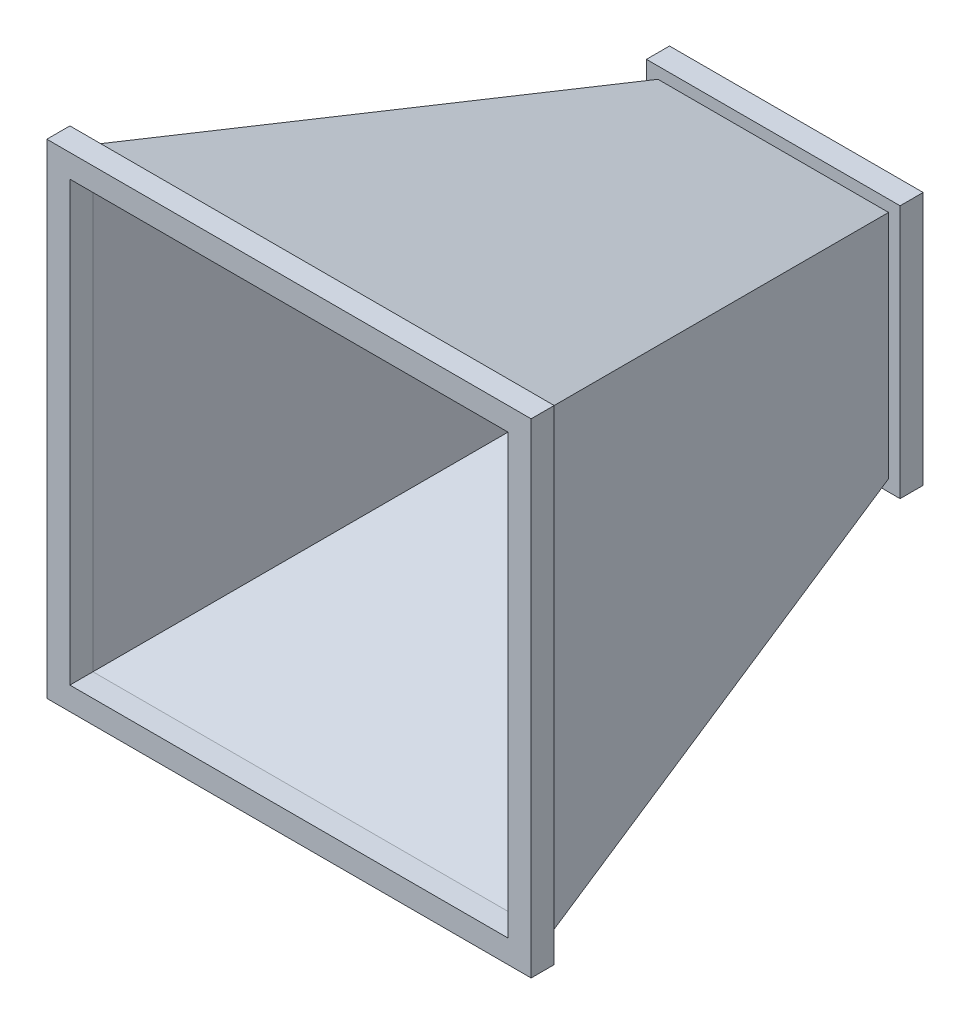
ISO-10303-21;
HEADER;
FILE_DESCRIPTION(('STEP AP214'),'2;1');
FILE_NAME('part.step','',(''),(''),'','','');
FILE_SCHEMA(('AUTOMOTIVE_DESIGN { 1 0 10303 214 1 1 1 1 }'));
ENDSEC;
DATA;
#1=APPLICATION_CONTEXT('core data for automotive mechanical design processes');
#2=APPLICATION_PROTOCOL_DEFINITION('international standard','automotive_design',2000,#1);
#3=PRODUCT_CONTEXT('',#1,'mechanical');
#4=PRODUCT('Part','Part','',(#3));
#5=PRODUCT_RELATED_PRODUCT_CATEGORY('part','',(#4));
#6=PRODUCT_DEFINITION_FORMATION('','',#4);
#7=PRODUCT_DEFINITION_CONTEXT('part definition',#1,'design');
#8=PRODUCT_DEFINITION('design','',#6,#7);
#9=PRODUCT_DEFINITION_SHAPE('','',#8);
#10=(LENGTH_UNIT() NAMED_UNIT(*) SI_UNIT(.MILLI.,.METRE.));
#11=(NAMED_UNIT(*) PLANE_ANGLE_UNIT() SI_UNIT($,.RADIAN.));
#12=(NAMED_UNIT(*) SI_UNIT($,.STERADIAN.) SOLID_ANGLE_UNIT());
#13=UNCERTAINTY_MEASURE_WITH_UNIT(LENGTH_MEASURE(1.E-05),#10,'distance_accuracy_value','');
#14=(GEOMETRIC_REPRESENTATION_CONTEXT(3) GLOBAL_UNCERTAINTY_ASSIGNED_CONTEXT((#13)) GLOBAL_UNIT_ASSIGNED_CONTEXT((#10,
#11,#12)) REPRESENTATION_CONTEXT('',''));
#15=CARTESIAN_POINT('',(0.,0.,0.));
#16=DIRECTION('',(0.,0.,1.));
#17=DIRECTION('',(1.,0.,0.));
#18=AXIS2_PLACEMENT_3D('',#15,#16,#17);
#19=CARTESIAN_POINT('',(119.529411764706,0.,-29.8823529411765));
#20=DIRECTION('',(0.970142500145332,0.,-0.242535625036333));
#21=DIRECTION('',(-0.242535625036333,0.,-0.970142500145332));
#22=AXIS2_PLACEMENT_3D('',#19,#20,#21);
#23=PLANE('',#22);
#24=DIRECTION('',(-0.235702260395516,0.235702260395516,-0.942809041582063));
#25=VECTOR('',#24,1.);
#26=CARTESIAN_POINT('',(254.,-254.,508.));
#27=LINE('',#26,#25);
#28=CARTESIAN_POINT('',(254.,-254.,508.));
#29=VERTEX_POINT('',#28);
#30=CARTESIAN_POINT('',(127.,-127.,0.));
#31=VERTEX_POINT('',#30);
#32=EDGE_CURVE('E364',#29,#31,#27,.T.);
#33=ORIENTED_EDGE('',*,*,#32,.T.);
#34=DIRECTION('',(0.,1.,0.));
#35=VECTOR('',#34,1.);
#36=CARTESIAN_POINT('',(127.,-127.,0.));
#37=LINE('',#36,#35);
#38=CARTESIAN_POINT('',(127.,127.,0.));
#39=VERTEX_POINT('',#38);
#40=EDGE_CURVE('E374',#31,#39,#37,.T.);
#41=ORIENTED_EDGE('',*,*,#40,.T.);
#42=DIRECTION('',(-0.235702260395516,-0.235702260395516,-0.942809041582063));
#43=VECTOR('',#42,1.);
#44=CARTESIAN_POINT('',(254.,254.,508.));
#45=LINE('',#44,#43);
#46=CARTESIAN_POINT('',(254.,254.,508.));
#47=VERTEX_POINT('',#46);
#48=EDGE_CURVE('E361',#47,#39,#45,.T.);
#49=ORIENTED_EDGE('',*,*,#48,.F.);
#50=DIRECTION('',(0.,1.,0.));
#51=VECTOR('',#50,1.);
#52=CARTESIAN_POINT('',(254.,-254.,508.));
#53=LINE('',#52,#51);
#54=EDGE_CURVE('E391',#29,#47,#53,.T.);
#55=ORIENTED_EDGE('',*,*,#54,.F.);
#56=EDGE_LOOP('',(#33,#41,#49,#55));
#57=FACE_BOUND('',#56,.T.);
#58=ADVANCED_FACE('F57',(#57),#23,.T.);
#59=CARTESIAN_POINT('',(0.,119.529411764706,-29.8823529411765));
#60=DIRECTION('',(0.,0.970142500145332,-0.242535625036333));
#61=DIRECTION('',(0.,0.242535625036333,0.970142500145332));
#62=AXIS2_PLACEMENT_3D('',#59,#60,#61);
#63=PLANE('',#62);
#64=ORIENTED_EDGE('',*,*,#48,.T.);
#65=DIRECTION('',(-1.,0.,0.));
#66=VECTOR('',#65,1.);
#67=CARTESIAN_POINT('',(-127.,127.,0.));
#68=LINE('',#67,#66);
#69=CARTESIAN_POINT('',(-127.,127.,0.));
#70=VERTEX_POINT('',#69);
#71=EDGE_CURVE('E481',#39,#70,#68,.T.);
#72=ORIENTED_EDGE('',*,*,#71,.T.);
#73=DIRECTION('',(0.235702260395516,-0.235702260395516,-0.942809041582063));
#74=VECTOR('',#73,1.);
#75=CARTESIAN_POINT('',(-254.,254.,508.));
#76=LINE('',#75,#74);
#77=CARTESIAN_POINT('',(-254.,254.,508.));
#78=VERTEX_POINT('',#77);
#79=EDGE_CURVE('E360',#78,#70,#76,.T.);
#80=ORIENTED_EDGE('',*,*,#79,.F.);
#81=DIRECTION('',(-1.,0.,0.));
#82=VECTOR('',#81,1.);
#83=CARTESIAN_POINT('',(-254.,254.,508.));
#84=LINE('',#83,#82);
#85=EDGE_CURVE('E453',#47,#78,#84,.T.);
#86=ORIENTED_EDGE('',*,*,#85,.F.);
#87=EDGE_LOOP('',(#64,#72,#80,#86));
#88=FACE_BOUND('',#87,.T.);
#89=ADVANCED_FACE('F497',(#88),#63,.T.);
#90=CARTESIAN_POINT('',(0.,-119.529411764706,-29.8823529411765));
#91=DIRECTION('',(0.,-0.970142500145332,-0.242535625036333));
#92=DIRECTION('',(0.,0.242535625036333,-0.970142500145332));
#93=AXIS2_PLACEMENT_3D('',#90,#91,#92);
#94=PLANE('',#93);
#95=DIRECTION('',(0.235702260395516,0.235702260395516,-0.942809041582063));
#96=VECTOR('',#95,1.);
#97=CARTESIAN_POINT('',(-254.,-254.,508.));
#98=LINE('',#97,#96);
#99=CARTESIAN_POINT('',(-254.,-254.,508.));
#100=VERTEX_POINT('',#99);
#101=CARTESIAN_POINT('',(-127.,-127.,0.));
#102=VERTEX_POINT('',#101);
#103=EDGE_CURVE('E356',#100,#102,#98,.T.);
#104=ORIENTED_EDGE('',*,*,#103,.T.);
#105=DIRECTION('',(1.,0.,0.));
#106=VECTOR('',#105,1.);
#107=CARTESIAN_POINT('',(-127.,-127.,0.));
#108=LINE('',#107,#106);
#109=EDGE_CURVE('E12',#102,#31,#108,.T.);
#110=ORIENTED_EDGE('',*,*,#109,.T.);
#111=ORIENTED_EDGE('',*,*,#32,.F.);
#112=DIRECTION('',(1.,0.,0.));
#113=VECTOR('',#112,1.);
#114=CARTESIAN_POINT('',(-254.,-254.,508.));
#115=LINE('',#114,#113);
#116=EDGE_CURVE('E368',#100,#29,#115,.T.);
#117=ORIENTED_EDGE('',*,*,#116,.F.);
#118=EDGE_LOOP('',(#104,#110,#111,#117));
#119=FACE_BOUND('',#118,.T.);
#120=ADVANCED_FACE('F503',(#119),#94,.T.);
#121=CARTESIAN_POINT('',(-119.529411764706,0.,-29.8823529411765));
#122=DIRECTION('',(-0.970142500145332,0.,-0.242535625036333));
#123=DIRECTION('',(-0.242535625036333,0.,0.970142500145332));
#124=AXIS2_PLACEMENT_3D('',#121,#122,#123);
#125=PLANE('',#124);
#126=ORIENTED_EDGE('',*,*,#79,.T.);
#127=DIRECTION('',(0.,-1.,0.));
#128=VECTOR('',#127,1.);
#129=CARTESIAN_POINT('',(-127.,-127.,0.));
#130=LINE('',#129,#128);
#131=EDGE_CURVE('E67',#70,#102,#130,.T.);
#132=ORIENTED_EDGE('',*,*,#131,.T.);
#133=ORIENTED_EDGE('',*,*,#103,.F.);
#134=DIRECTION('',(0.,-1.,0.));
#135=VECTOR('',#134,1.);
#136=CARTESIAN_POINT('',(-254.,-254.,508.));
#137=LINE('',#136,#135);
#138=EDGE_CURVE('E447',#78,#100,#137,.T.);
#139=ORIENTED_EDGE('',*,*,#138,.F.);
#140=EDGE_LOOP('',(#126,#132,#133,#139));
#141=FACE_BOUND('',#140,.T.);
#142=ADVANCED_FACE('F59',(#141),#125,.T.);
#143=CARTESIAN_POINT('',(0.,107.576470588235,-26.8941176470588));
#144=DIRECTION('',(0.,-0.970142500145332,0.242535625036333));
#145=DIRECTION('',(0.,-0.242535625036333,-0.970142500145332));
#146=AXIS2_PLACEMENT_3D('',#143,#144,#145);
#147=PLANE('',#146);
#148=DIRECTION('',(-0.235702260395516,0.235702260395516,0.942809041582063));
#149=VECTOR('',#148,1.);
#150=CARTESIAN_POINT('',(-114.3,114.3,0.));
#151=LINE('',#150,#149);
#152=CARTESIAN_POINT('',(-114.3,114.3,0.));
#153=VERTEX_POINT('',#152);
#154=CARTESIAN_POINT('',(-241.3,241.3,508.));
#155=VERTEX_POINT('',#154);
#156=EDGE_CURVE('E336',#153,#155,#151,.T.);
#157=ORIENTED_EDGE('',*,*,#156,.F.);
#158=DIRECTION('',(1.,0.,0.));
#159=VECTOR('',#158,1.);
#160=CARTESIAN_POINT('',(-114.3,114.3,0.));
#161=LINE('',#160,#159);
#162=CARTESIAN_POINT('',(114.3,114.3,0.));
#163=VERTEX_POINT('',#162);
#164=EDGE_CURVE('E215',#153,#163,#161,.T.);
#165=ORIENTED_EDGE('',*,*,#164,.T.);
#166=DIRECTION('',(0.235702260395516,0.235702260395516,0.942809041582063));
#167=VECTOR('',#166,1.);
#168=CARTESIAN_POINT('',(114.3,114.3,0.));
#169=LINE('',#168,#167);
#170=CARTESIAN_POINT('',(241.3,241.3,508.));
#171=VERTEX_POINT('',#170);
#172=EDGE_CURVE('E331',#163,#171,#169,.T.);
#173=ORIENTED_EDGE('',*,*,#172,.T.);
#174=DIRECTION('',(-1.,0.,0.));
#175=VECTOR('',#174,1.);
#176=CARTESIAN_POINT('',(241.3,241.3,508.));
#177=LINE('',#176,#175);
#178=EDGE_CURVE('E392',#171,#155,#177,.T.);
#179=ORIENTED_EDGE('',*,*,#178,.T.);
#180=EDGE_LOOP('',(#157,#165,#173,#179));
#181=FACE_BOUND('',#180,.T.);
#182=ADVANCED_FACE('F507',(#181),#147,.T.);
#183=CARTESIAN_POINT('',(107.576470588235,0.,-26.8941176470588));
#184=DIRECTION('',(-0.970142500145332,0.,0.242535625036333));
#185=DIRECTION('',(0.242535625036333,0.,0.970142500145332));
#186=AXIS2_PLACEMENT_3D('',#183,#184,#185);
#187=PLANE('',#186);
#188=ORIENTED_EDGE('',*,*,#172,.F.);
#189=DIRECTION('',(0.,-1.,0.));
#190=VECTOR('',#189,1.);
#191=CARTESIAN_POINT('',(114.3,114.3,0.));
#192=LINE('',#191,#190);
#193=CARTESIAN_POINT('',(114.3,-114.3,0.));
#194=VERTEX_POINT('',#193);
#195=EDGE_CURVE('E348',#163,#194,#192,.T.);
#196=ORIENTED_EDGE('',*,*,#195,.T.);
#197=DIRECTION('',(0.235702260395516,-0.235702260395516,0.942809041582063));
#198=VECTOR('',#197,1.);
#199=CARTESIAN_POINT('',(114.3,-114.3,0.));
#200=LINE('',#199,#198);
#201=CARTESIAN_POINT('',(241.3,-241.3,508.));
#202=VERTEX_POINT('',#201);
#203=EDGE_CURVE('E339',#194,#202,#200,.T.);
#204=ORIENTED_EDGE('',*,*,#203,.T.);
#205=DIRECTION('',(0.,1.,0.));
#206=VECTOR('',#205,1.);
#207=CARTESIAN_POINT('',(241.3,-241.3,508.));
#208=LINE('',#207,#206);
#209=EDGE_CURVE('E384',#202,#171,#208,.T.);
#210=ORIENTED_EDGE('',*,*,#209,.T.);
#211=EDGE_LOOP('',(#188,#196,#204,#210));
#212=FACE_BOUND('',#211,.T.);
#213=ADVANCED_FACE('F512',(#212),#187,.T.);
#214=CARTESIAN_POINT('',(-107.576470588235,0.,-26.8941176470588));
#215=DIRECTION('',(0.970142500145332,0.,0.242535625036333));
#216=DIRECTION('',(0.242535625036333,0.,-0.970142500145332));
#217=AXIS2_PLACEMENT_3D('',#214,#215,#216);
#218=PLANE('',#217);
#219=DIRECTION('',(-0.235702260395516,-0.235702260395516,0.942809041582063));
#220=VECTOR('',#219,1.);
#221=CARTESIAN_POINT('',(-114.3,-114.3,0.));
#222=LINE('',#221,#220);
#223=CARTESIAN_POINT('',(-114.3,-114.3,0.));
#224=VERTEX_POINT('',#223);
#225=CARTESIAN_POINT('',(-241.3,-241.3,508.));
#226=VERTEX_POINT('',#225);
#227=EDGE_CURVE('E335',#224,#226,#222,.T.);
#228=ORIENTED_EDGE('',*,*,#227,.F.);
#229=DIRECTION('',(0.,1.,0.));
#230=VECTOR('',#229,1.);
#231=CARTESIAN_POINT('',(-114.3,-114.3,0.));
#232=LINE('',#231,#230);
#233=EDGE_CURVE('E408',#224,#153,#232,.T.);
#234=ORIENTED_EDGE('',*,*,#233,.T.);
#235=ORIENTED_EDGE('',*,*,#156,.T.);
#236=DIRECTION('',(0.,-1.,0.));
#237=VECTOR('',#236,1.);
#238=CARTESIAN_POINT('',(-241.3,241.3,508.));
#239=LINE('',#238,#237);
#240=EDGE_CURVE('E387',#155,#226,#239,.T.);
#241=ORIENTED_EDGE('',*,*,#240,.T.);
#242=EDGE_LOOP('',(#228,#234,#235,#241));
#243=FACE_BOUND('',#242,.T.);
#244=ADVANCED_FACE('F525',(#243),#218,.T.);
#245=CARTESIAN_POINT('',(0.,-107.576470588235,-26.8941176470588));
#246=DIRECTION('',(0.,0.970142500145332,0.242535625036333));
#247=DIRECTION('',(0.,-0.242535625036333,0.970142500145332));
#248=AXIS2_PLACEMENT_3D('',#245,#246,#247);
#249=PLANE('',#248);
#250=ORIENTED_EDGE('',*,*,#203,.F.);
#251=DIRECTION('',(-1.,0.,0.));
#252=VECTOR('',#251,1.);
#253=CARTESIAN_POINT('',(114.3,-114.3,0.));
#254=LINE('',#253,#252);
#255=EDGE_CURVE('E330',#194,#224,#254,.T.);
#256=ORIENTED_EDGE('',*,*,#255,.T.);
#257=ORIENTED_EDGE('',*,*,#227,.T.);
#258=DIRECTION('',(1.,0.,0.));
#259=VECTOR('',#258,1.);
#260=CARTESIAN_POINT('',(-241.3,-241.3,508.));
#261=LINE('',#260,#259);
#262=EDGE_CURVE('E75',#226,#202,#261,.T.);
#263=ORIENTED_EDGE('',*,*,#262,.T.);
#264=EDGE_LOOP('',(#250,#256,#257,#263));
#265=FACE_BOUND('',#264,.T.);
#266=ADVANCED_FACE('F522',(#265),#249,.T.);
#267=CARTESIAN_POINT('',(0.,0.,508.));
#268=DIRECTION('',(0.,0.,1.));
#269=DIRECTION('',(1.,0.,0.));
#270=AXIS2_PLACEMENT_3D('',#267,#268,#269);
#271=PLANE('',#270);
#272=DIRECTION('',(1.,0.,0.));
#273=VECTOR('',#272,1.);
#274=CARTESIAN_POINT('',(-266.7,-266.7,508.));
#275=LINE('',#274,#273);
#276=CARTESIAN_POINT('',(-266.7,-266.7,508.));
#277=VERTEX_POINT('',#276);
#278=CARTESIAN_POINT('',(266.7,-266.7,508.));
#279=VERTEX_POINT('',#278);
#280=EDGE_CURVE('E302',#277,#279,#275,.T.);
#281=ORIENTED_EDGE('',*,*,#280,.F.);
#282=DIRECTION('',(0.,-1.,0.));
#283=VECTOR('',#282,1.);
#284=CARTESIAN_POINT('',(-266.7,266.7,508.));
#285=LINE('',#284,#283);
#286=CARTESIAN_POINT('',(-266.7,266.7,508.));
#287=VERTEX_POINT('',#286);
#288=EDGE_CURVE('E292',#287,#277,#285,.T.);
#289=ORIENTED_EDGE('',*,*,#288,.F.);
#290=DIRECTION('',(-1.,0.,0.));
#291=VECTOR('',#290,1.);
#292=CARTESIAN_POINT('',(266.7,266.7,508.));
#293=LINE('',#292,#291);
#294=CARTESIAN_POINT('',(266.7,266.7,508.));
#295=VERTEX_POINT('',#294);
#296=EDGE_CURVE('E310',#295,#287,#293,.T.);
#297=ORIENTED_EDGE('',*,*,#296,.F.);
#298=DIRECTION('',(0.,1.,0.));
#299=VECTOR('',#298,1.);
#300=CARTESIAN_POINT('',(266.7,-266.7,508.));
#301=LINE('',#300,#299);
#302=EDGE_CURVE('E306',#279,#295,#301,.T.);
#303=ORIENTED_EDGE('',*,*,#302,.F.);
#304=EDGE_LOOP('',(#281,#289,#297,#303));
#305=FACE_BOUND('',#304,.T.);
#306=ORIENTED_EDGE('',*,*,#116,.T.);
#307=ORIENTED_EDGE('',*,*,#54,.T.);
#308=ORIENTED_EDGE('',*,*,#85,.T.);
#309=ORIENTED_EDGE('',*,*,#138,.T.);
#310=EDGE_LOOP('',(#306,#307,#308,#309));
#311=FACE_BOUND('',#310,.T.);
#312=ADVANCED_FACE('F500',(#305,#311),#271,.F.);
#313=CARTESIAN_POINT('',(0.,0.,533.4));
#314=DIRECTION('',(0.,0.,1.));
#315=DIRECTION('',(1.,0.,0.));
#316=AXIS2_PLACEMENT_3D('',#313,#314,#315);
#317=PLANE('',#316);
#318=DIRECTION('',(1.,0.,0.));
#319=VECTOR('',#318,1.);
#320=CARTESIAN_POINT('',(-266.7,-266.7,533.4));
#321=LINE('',#320,#319);
#322=CARTESIAN_POINT('',(-266.7,-266.7,533.4));
#323=VERTEX_POINT('',#322);
#324=CARTESIAN_POINT('',(266.7,-266.7,533.4));
#325=VERTEX_POINT('',#324);
#326=EDGE_CURVE('E287',#323,#325,#321,.T.);
#327=ORIENTED_EDGE('',*,*,#326,.T.);
#328=DIRECTION('',(0.,1.,0.));
#329=VECTOR('',#328,1.);
#330=CARTESIAN_POINT('',(266.7,-266.7,533.4));
#331=LINE('',#330,#329);
#332=CARTESIAN_POINT('',(266.7,266.7,533.4));
#333=VERTEX_POINT('',#332);
#334=EDGE_CURVE('E291',#325,#333,#331,.T.);
#335=ORIENTED_EDGE('',*,*,#334,.T.);
#336=DIRECTION('',(-1.,0.,0.));
#337=VECTOR('',#336,1.);
#338=CARTESIAN_POINT('',(266.7,266.7,533.4));
#339=LINE('',#338,#337);
#340=CARTESIAN_POINT('',(-266.7,266.7,533.4));
#341=VERTEX_POINT('',#340);
#342=EDGE_CURVE('E295',#333,#341,#339,.T.);
#343=ORIENTED_EDGE('',*,*,#342,.T.);
#344=DIRECTION('',(0.,-1.,0.));
#345=VECTOR('',#344,1.);
#346=CARTESIAN_POINT('',(-266.7,266.7,533.4));
#347=LINE('',#346,#345);
#348=EDGE_CURVE('E298',#341,#323,#347,.T.);
#349=ORIENTED_EDGE('',*,*,#348,.T.);
#350=EDGE_LOOP('',(#327,#335,#343,#349));
#351=FACE_BOUND('',#350,.T.);
#352=DIRECTION('',(-1.,0.,0.));
#353=VECTOR('',#352,1.);
#354=CARTESIAN_POINT('',(-241.3,241.3,533.4));
#355=LINE('',#354,#353);
#356=CARTESIAN_POINT('',(241.3,241.3,533.4));
#357=VERTEX_POINT('',#356);
#358=CARTESIAN_POINT('',(-241.3,241.3,533.4));
#359=VERTEX_POINT('',#358);
#360=EDGE_CURVE('E276',#357,#359,#355,.T.);
#361=ORIENTED_EDGE('',*,*,#360,.F.);
#362=DIRECTION('',(0.,1.,0.));
#363=VECTOR('',#362,1.);
#364=CARTESIAN_POINT('',(241.3,-241.3,533.4));
#365=LINE('',#364,#363);
#366=CARTESIAN_POINT('',(241.3,-241.3,533.4));
#367=VERTEX_POINT('',#366);
#368=EDGE_CURVE('E273',#367,#357,#365,.T.);
#369=ORIENTED_EDGE('',*,*,#368,.F.);
#370=DIRECTION('',(1.,0.,0.));
#371=VECTOR('',#370,1.);
#372=CARTESIAN_POINT('',(-241.3,-241.3,533.4));
#373=LINE('',#372,#371);
#374=CARTESIAN_POINT('',(-241.3,-241.3,533.4));
#375=VERTEX_POINT('',#374);
#376=EDGE_CURVE('E283',#375,#367,#373,.T.);
#377=ORIENTED_EDGE('',*,*,#376,.F.);
#378=DIRECTION('',(0.,-1.,0.));
#379=VECTOR('',#378,1.);
#380=CARTESIAN_POINT('',(-241.3,-241.3,533.4));
#381=LINE('',#380,#379);
#382=EDGE_CURVE('E279',#359,#375,#381,.T.);
#383=ORIENTED_EDGE('',*,*,#382,.F.);
#384=EDGE_LOOP('',(#361,#369,#377,#383));
#385=FACE_BOUND('',#384,.T.);
#386=ADVANCED_FACE('F537',(#351,#385),#317,.T.);
#387=CARTESIAN_POINT('',(-266.7,-266.7,533.4));
#388=DIRECTION('',(0.,1.,0.));
#389=DIRECTION('',(0.,0.,1.));
#390=AXIS2_PLACEMENT_3D('',#387,#388,#389);
#391=PLANE('',#390);
#392=ORIENTED_EDGE('',*,*,#280,.T.);
#393=DIRECTION('',(0.,0.,-1.));
#394=VECTOR('',#393,1.);
#395=CARTESIAN_POINT('',(266.7,-266.7,533.4));
#396=LINE('',#395,#394);
#397=EDGE_CURVE('E326',#325,#279,#396,.T.);
#398=ORIENTED_EDGE('',*,*,#397,.F.);
#399=ORIENTED_EDGE('',*,*,#326,.F.);
#400=DIRECTION('',(0.,0.,-1.));
#401=VECTOR('',#400,1.);
#402=CARTESIAN_POINT('',(-266.7,-266.7,533.4));
#403=LINE('',#402,#401);
#404=EDGE_CURVE('E301',#323,#277,#403,.T.);
#405=ORIENTED_EDGE('',*,*,#404,.T.);
#406=EDGE_LOOP('',(#392,#398,#399,#405));
#407=FACE_BOUND('',#406,.T.);
#408=ADVANCED_FACE('F533',(#407),#391,.F.);
#409=CARTESIAN_POINT('',(266.7,-266.7,533.4));
#410=DIRECTION('',(-1.,0.,0.));
#411=DIRECTION('',(0.,0.,1.));
#412=AXIS2_PLACEMENT_3D('',#409,#410,#411);
#413=PLANE('',#412);
#414=ORIENTED_EDGE('',*,*,#302,.T.);
#415=DIRECTION('',(0.,0.,-1.));
#416=VECTOR('',#415,1.);
#417=CARTESIAN_POINT('',(266.7,266.7,533.4));
#418=LINE('',#417,#416);
#419=EDGE_CURVE('E322',#333,#295,#418,.T.);
#420=ORIENTED_EDGE('',*,*,#419,.F.);
#421=ORIENTED_EDGE('',*,*,#334,.F.);
#422=ORIENTED_EDGE('',*,*,#397,.T.);
#423=EDGE_LOOP('',(#414,#420,#421,#422));
#424=FACE_BOUND('',#423,.T.);
#425=ADVANCED_FACE('F536',(#424),#413,.F.);
#426=CARTESIAN_POINT('',(266.7,266.7,533.4));
#427=DIRECTION('',(0.,-1.,0.));
#428=DIRECTION('',(0.,0.,-1.));
#429=AXIS2_PLACEMENT_3D('',#426,#427,#428);
#430=PLANE('',#429);
#431=ORIENTED_EDGE('',*,*,#296,.T.);
#432=DIRECTION('',(0.,0.,-1.));
#433=VECTOR('',#432,1.);
#434=CARTESIAN_POINT('',(-266.7,266.7,533.4));
#435=LINE('',#434,#433);
#436=EDGE_CURVE('E318',#341,#287,#435,.T.);
#437=ORIENTED_EDGE('',*,*,#436,.F.);
#438=ORIENTED_EDGE('',*,*,#342,.F.);
#439=ORIENTED_EDGE('',*,*,#419,.T.);
#440=EDGE_LOOP('',(#431,#437,#438,#439));
#441=FACE_BOUND('',#440,.T.);
#442=ADVANCED_FACE('F541',(#441),#430,.F.);
#443=CARTESIAN_POINT('',(-266.7,266.7,533.4));
#444=DIRECTION('',(1.,0.,0.));
#445=DIRECTION('',(0.,0.,-1.));
#446=AXIS2_PLACEMENT_3D('',#443,#444,#445);
#447=PLANE('',#446);
#448=ORIENTED_EDGE('',*,*,#288,.T.);
#449=ORIENTED_EDGE('',*,*,#404,.F.);
#450=ORIENTED_EDGE('',*,*,#348,.F.);
#451=ORIENTED_EDGE('',*,*,#436,.T.);
#452=EDGE_LOOP('',(#448,#449,#450,#451));
#453=FACE_BOUND('',#452,.T.);
#454=ADVANCED_FACE('F545',(#453),#447,.F.);
#455=CARTESIAN_POINT('',(241.3,-241.3,533.4));
#456=DIRECTION('',(-1.,0.,0.));
#457=DIRECTION('',(0.,0.,1.));
#458=AXIS2_PLACEMENT_3D('',#455,#456,#457);
#459=PLANE('',#458);
#460=ORIENTED_EDGE('',*,*,#209,.F.);
#461=DIRECTION('',(0.,0.,-1.));
#462=VECTOR('',#461,1.);
#463=CARTESIAN_POINT('',(241.3,-241.3,533.4));
#464=LINE('',#463,#462);
#465=EDGE_CURVE('E286',#367,#202,#464,.T.);
#466=ORIENTED_EDGE('',*,*,#465,.F.);
#467=ORIENTED_EDGE('',*,*,#368,.T.);
#468=DIRECTION('',(0.,0.,-1.));
#469=VECTOR('',#468,1.);
#470=CARTESIAN_POINT('',(241.3,241.3,533.4));
#471=LINE('',#470,#469);
#472=EDGE_CURVE('E307',#357,#171,#471,.T.);
#473=ORIENTED_EDGE('',*,*,#472,.T.);
#474=EDGE_LOOP('',(#460,#466,#467,#473));
#475=FACE_BOUND('',#474,.T.);
#476=ADVANCED_FACE('F549',(#475),#459,.T.);
#477=CARTESIAN_POINT('',(-241.3,241.3,533.4));
#478=DIRECTION('',(0.,-1.,0.));
#479=DIRECTION('',(0.,0.,-1.));
#480=AXIS2_PLACEMENT_3D('',#477,#478,#479);
#481=PLANE('',#480);
#482=ORIENTED_EDGE('',*,*,#178,.F.);
#483=ORIENTED_EDGE('',*,*,#472,.F.);
#484=ORIENTED_EDGE('',*,*,#360,.T.);
#485=DIRECTION('',(0.,0.,-1.));
#486=VECTOR('',#485,1.);
#487=CARTESIAN_POINT('',(-241.3,241.3,533.4));
#488=LINE('',#487,#486);
#489=EDGE_CURVE('E428',#359,#155,#488,.T.);
#490=ORIENTED_EDGE('',*,*,#489,.T.);
#491=EDGE_LOOP('',(#482,#483,#484,#490));
#492=FACE_BOUND('',#491,.T.);
#493=ADVANCED_FACE('F559',(#492),#481,.T.);
#494=CARTESIAN_POINT('',(-241.3,-241.3,533.4));
#495=DIRECTION('',(1.,0.,0.));
#496=DIRECTION('',(0.,0.,-1.));
#497=AXIS2_PLACEMENT_3D('',#494,#495,#496);
#498=PLANE('',#497);
#499=ORIENTED_EDGE('',*,*,#240,.F.);
#500=ORIENTED_EDGE('',*,*,#489,.F.);
#501=ORIENTED_EDGE('',*,*,#382,.T.);
#502=DIRECTION('',(0.,0.,-1.));
#503=VECTOR('',#502,1.);
#504=CARTESIAN_POINT('',(-241.3,-241.3,533.4));
#505=LINE('',#504,#503);
#506=EDGE_CURVE('E425',#375,#226,#505,.T.);
#507=ORIENTED_EDGE('',*,*,#506,.T.);
#508=EDGE_LOOP('',(#499,#500,#501,#507));
#509=FACE_BOUND('',#508,.T.);
#510=ADVANCED_FACE('F563',(#509),#498,.T.);
#511=CARTESIAN_POINT('',(-241.3,-241.3,533.4));
#512=DIRECTION('',(0.,1.,0.));
#513=DIRECTION('',(0.,0.,1.));
#514=AXIS2_PLACEMENT_3D('',#511,#512,#513);
#515=PLANE('',#514);
#516=ORIENTED_EDGE('',*,*,#262,.F.);
#517=ORIENTED_EDGE('',*,*,#506,.F.);
#518=ORIENTED_EDGE('',*,*,#376,.T.);
#519=ORIENTED_EDGE('',*,*,#465,.T.);
#520=EDGE_LOOP('',(#516,#517,#518,#519));
#521=FACE_BOUND('',#520,.T.);
#522=ADVANCED_FACE('F567',(#521),#515,.T.);
#523=CARTESIAN_POINT('',(0.,0.,0.));
#524=DIRECTION('',(0.,0.,-1.));
#525=DIRECTION('',(-1.,0.,0.));
#526=AXIS2_PLACEMENT_3D('',#523,#524,#525);
#527=PLANE('',#526);
#528=DIRECTION('',(-1.,0.,0.));
#529=VECTOR('',#528,1.);
#530=CARTESIAN_POINT('',(139.7,-139.7,0.));
#531=LINE('',#530,#529);
#532=CARTESIAN_POINT('',(139.7,-139.7,0.));
#533=VERTEX_POINT('',#532);
#534=CARTESIAN_POINT('',(-139.7,-139.7,0.));
#535=VERTEX_POINT('',#534);
#536=EDGE_CURVE('E217',#533,#535,#531,.T.);
#537=ORIENTED_EDGE('',*,*,#536,.F.);
#538=DIRECTION('',(0.,-1.,0.));
#539=VECTOR('',#538,1.);
#540=CARTESIAN_POINT('',(139.7,139.7,0.));
#541=LINE('',#540,#539);
#542=CARTESIAN_POINT('',(139.7,139.7,0.));
#543=VERTEX_POINT('',#542);
#544=EDGE_CURVE('E237',#543,#533,#541,.T.);
#545=ORIENTED_EDGE('',*,*,#544,.F.);
#546=DIRECTION('',(1.,0.,0.));
#547=VECTOR('',#546,1.);
#548=CARTESIAN_POINT('',(-139.7,139.7,0.));
#549=LINE('',#548,#547);
#550=CARTESIAN_POINT('',(-139.7,139.7,0.));
#551=VERTEX_POINT('',#550);
#552=EDGE_CURVE('E253',#551,#543,#549,.T.);
#553=ORIENTED_EDGE('',*,*,#552,.F.);
#554=DIRECTION('',(0.,1.,0.));
#555=VECTOR('',#554,1.);
#556=CARTESIAN_POINT('',(-139.7,-139.7,0.));
#557=LINE('',#556,#555);
#558=EDGE_CURVE('E250',#535,#551,#557,.T.);
#559=ORIENTED_EDGE('',*,*,#558,.F.);
#560=EDGE_LOOP('',(#537,#545,#553,#559));
#561=FACE_BOUND('',#560,.T.);
#562=ORIENTED_EDGE('',*,*,#71,.F.);
#563=ORIENTED_EDGE('',*,*,#40,.F.);
#564=ORIENTED_EDGE('',*,*,#109,.F.);
#565=ORIENTED_EDGE('',*,*,#131,.F.);
#566=EDGE_LOOP('',(#562,#563,#564,#565));
#567=FACE_BOUND('',#566,.T.);
#568=ADVANCED_FACE('F504',(#561,#567),#527,.F.);
#569=CARTESIAN_POINT('',(0.,0.,-25.4));
#570=DIRECTION('',(0.,0.,-1.));
#571=DIRECTION('',(-1.,0.,0.));
#572=AXIS2_PLACEMENT_3D('',#569,#570,#571);
#573=PLANE('',#572);
#574=DIRECTION('',(-1.,0.,0.));
#575=VECTOR('',#574,1.);
#576=CARTESIAN_POINT('',(139.7,-139.7,-25.4));
#577=LINE('',#576,#575);
#578=CARTESIAN_POINT('',(139.7,-139.7,-25.4));
#579=VERTEX_POINT('',#578);
#580=CARTESIAN_POINT('',(-139.7,-139.7,-25.4));
#581=VERTEX_POINT('',#580);
#582=EDGE_CURVE('E232',#579,#581,#577,.T.);
#583=ORIENTED_EDGE('',*,*,#582,.T.);
#584=DIRECTION('',(0.,1.,0.));
#585=VECTOR('',#584,1.);
#586=CARTESIAN_POINT('',(-139.7,-139.7,-25.4));
#587=LINE('',#586,#585);
#588=CARTESIAN_POINT('',(-139.7,139.7,-25.4));
#589=VERTEX_POINT('',#588);
#590=EDGE_CURVE('E236',#581,#589,#587,.T.);
#591=ORIENTED_EDGE('',*,*,#590,.T.);
#592=DIRECTION('',(1.,0.,0.));
#593=VECTOR('',#592,1.);
#594=CARTESIAN_POINT('',(-139.7,139.7,-25.4));
#595=LINE('',#594,#593);
#596=CARTESIAN_POINT('',(139.7,139.7,-25.4));
#597=VERTEX_POINT('',#596);
#598=EDGE_CURVE('E240',#589,#597,#595,.T.);
#599=ORIENTED_EDGE('',*,*,#598,.T.);
#600=DIRECTION('',(0.,-1.,0.));
#601=VECTOR('',#600,1.);
#602=CARTESIAN_POINT('',(139.7,139.7,-25.4));
#603=LINE('',#602,#601);
#604=EDGE_CURVE('E243',#597,#579,#603,.T.);
#605=ORIENTED_EDGE('',*,*,#604,.T.);
#606=EDGE_LOOP('',(#583,#591,#599,#605));
#607=FACE_BOUND('',#606,.T.);
#608=DIRECTION('',(1.,0.,0.));
#609=VECTOR('',#608,1.);
#610=CARTESIAN_POINT('',(114.3,114.3,-25.4));
#611=LINE('',#610,#609);
#612=CARTESIAN_POINT('',(-114.3,114.3,-25.4));
#613=VERTEX_POINT('',#612);
#614=CARTESIAN_POINT('',(114.3,114.3,-25.4));
#615=VERTEX_POINT('',#614);
#616=EDGE_CURVE('E209',#613,#615,#611,.T.);
#617=ORIENTED_EDGE('',*,*,#616,.F.);
#618=DIRECTION('',(0.,1.,0.));
#619=VECTOR('',#618,1.);
#620=CARTESIAN_POINT('',(-114.3,-114.3,-25.4));
#621=LINE('',#620,#619);
#622=CARTESIAN_POINT('',(-114.3,-114.3,-25.4));
#623=VERTEX_POINT('',#622);
#624=EDGE_CURVE('E198',#623,#613,#621,.T.);
#625=ORIENTED_EDGE('',*,*,#624,.F.);
#626=DIRECTION('',(-1.,0.,0.));
#627=VECTOR('',#626,1.);
#628=CARTESIAN_POINT('',(114.3,-114.3,-25.4));
#629=LINE('',#628,#627);
#630=CARTESIAN_POINT('',(114.3,-114.3,-25.4));
#631=VERTEX_POINT('',#630);
#632=EDGE_CURVE('E227',#631,#623,#629,.T.);
#633=ORIENTED_EDGE('',*,*,#632,.F.);
#634=DIRECTION('',(0.,-1.,0.));
#635=VECTOR('',#634,1.);
#636=CARTESIAN_POINT('',(114.3,-114.3,-25.4));
#637=LINE('',#636,#635);
#638=EDGE_CURVE('E223',#615,#631,#637,.T.);
#639=ORIENTED_EDGE('',*,*,#638,.F.);
#640=EDGE_LOOP('',(#617,#625,#633,#639));
#641=FACE_BOUND('',#640,.T.);
#642=ADVANCED_FACE('F221',(#607,#641),#573,.T.);
#643=CARTESIAN_POINT('',(139.7,-139.7,-25.4));
#644=DIRECTION('',(0.,1.,0.));
#645=DIRECTION('',(0.,0.,1.));
#646=AXIS2_PLACEMENT_3D('',#643,#644,#645);
#647=PLANE('',#646);
#648=ORIENTED_EDGE('',*,*,#536,.T.);
#649=DIRECTION('',(0.,0.,1.));
#650=VECTOR('',#649,1.);
#651=CARTESIAN_POINT('',(-139.7,-139.7,-25.4));
#652=LINE('',#651,#650);
#653=EDGE_CURVE('E269',#581,#535,#652,.T.);
#654=ORIENTED_EDGE('',*,*,#653,.F.);
#655=ORIENTED_EDGE('',*,*,#582,.F.);
#656=DIRECTION('',(0.,0.,1.));
#657=VECTOR('',#656,1.);
#658=CARTESIAN_POINT('',(139.7,-139.7,-25.4));
#659=LINE('',#658,#657);
#660=EDGE_CURVE('E246',#579,#533,#659,.T.);
#661=ORIENTED_EDGE('',*,*,#660,.T.);
#662=EDGE_LOOP('',(#648,#654,#655,#661));
#663=FACE_BOUND('',#662,.T.);
#664=ADVANCED_FACE('F571',(#663),#647,.F.);
#665=CARTESIAN_POINT('',(-139.7,-139.7,-25.4));
#666=DIRECTION('',(1.,0.,0.));
#667=DIRECTION('',(0.,0.,-1.));
#668=AXIS2_PLACEMENT_3D('',#665,#666,#667);
#669=PLANE('',#668);
#670=ORIENTED_EDGE('',*,*,#558,.T.);
#671=DIRECTION('',(0.,0.,1.));
#672=VECTOR('',#671,1.);
#673=CARTESIAN_POINT('',(-139.7,139.7,-25.4));
#674=LINE('',#673,#672);
#675=EDGE_CURVE('E265',#589,#551,#674,.T.);
#676=ORIENTED_EDGE('',*,*,#675,.F.);
#677=ORIENTED_EDGE('',*,*,#590,.F.);
#678=ORIENTED_EDGE('',*,*,#653,.T.);
#679=EDGE_LOOP('',(#670,#676,#677,#678));
#680=FACE_BOUND('',#679,.T.);
#681=ADVANCED_FACE('F574',(#680),#669,.F.);
#682=CARTESIAN_POINT('',(-139.7,139.7,-25.4));
#683=DIRECTION('',(0.,-1.,0.));
#684=DIRECTION('',(0.,0.,-1.));
#685=AXIS2_PLACEMENT_3D('',#682,#683,#684);
#686=PLANE('',#685);
#687=ORIENTED_EDGE('',*,*,#552,.T.);
#688=DIRECTION('',(0.,0.,1.));
#689=VECTOR('',#688,1.);
#690=CARTESIAN_POINT('',(139.7,139.7,-25.4));
#691=LINE('',#690,#689);
#692=EDGE_CURVE('E261',#597,#543,#691,.T.);
#693=ORIENTED_EDGE('',*,*,#692,.F.);
#694=ORIENTED_EDGE('',*,*,#598,.F.);
#695=ORIENTED_EDGE('',*,*,#675,.T.);
#696=EDGE_LOOP('',(#687,#693,#694,#695));
#697=FACE_BOUND('',#696,.T.);
#698=ADVANCED_FACE('F578',(#697),#686,.F.);
#699=CARTESIAN_POINT('',(139.7,139.7,-25.4));
#700=DIRECTION('',(-1.,0.,0.));
#701=DIRECTION('',(0.,0.,1.));
#702=AXIS2_PLACEMENT_3D('',#699,#700,#701);
#703=PLANE('',#702);
#704=ORIENTED_EDGE('',*,*,#544,.T.);
#705=ORIENTED_EDGE('',*,*,#660,.F.);
#706=ORIENTED_EDGE('',*,*,#604,.F.);
#707=ORIENTED_EDGE('',*,*,#692,.T.);
#708=EDGE_LOOP('',(#704,#705,#706,#707));
#709=FACE_BOUND('',#708,.T.);
#710=ADVANCED_FACE('F582',(#709),#703,.F.);
#711=CARTESIAN_POINT('',(-114.3,-114.3,-25.4));
#712=DIRECTION('',(1.,0.,0.));
#713=DIRECTION('',(0.,0.,-1.));
#714=AXIS2_PLACEMENT_3D('',#711,#712,#713);
#715=PLANE('',#714);
#716=ORIENTED_EDGE('',*,*,#233,.F.);
#717=DIRECTION('',(0.,0.,1.));
#718=VECTOR('',#717,1.);
#719=CARTESIAN_POINT('',(-114.3,-114.3,-25.4));
#720=LINE('',#719,#718);
#721=EDGE_CURVE('E204',#623,#224,#720,.T.);
#722=ORIENTED_EDGE('',*,*,#721,.F.);
#723=ORIENTED_EDGE('',*,*,#624,.T.);
#724=DIRECTION('',(0.,0.,1.));
#725=VECTOR('',#724,1.);
#726=CARTESIAN_POINT('',(-114.3,114.3,-25.4));
#727=LINE('',#726,#725);
#728=EDGE_CURVE('E202',#613,#153,#727,.T.);
#729=ORIENTED_EDGE('',*,*,#728,.T.);
#730=EDGE_LOOP('',(#716,#722,#723,#729));
#731=FACE_BOUND('',#730,.T.);
#732=ADVANCED_FACE('F201',(#731),#715,.T.);
#733=CARTESIAN_POINT('',(114.3,114.3,-25.4));
#734=DIRECTION('',(0.,-1.,0.));
#735=DIRECTION('',(0.,0.,-1.));
#736=AXIS2_PLACEMENT_3D('',#733,#734,#735);
#737=PLANE('',#736);
#738=ORIENTED_EDGE('',*,*,#164,.F.);
#739=ORIENTED_EDGE('',*,*,#728,.F.);
#740=ORIENTED_EDGE('',*,*,#616,.T.);
#741=DIRECTION('',(0.,0.,1.));
#742=VECTOR('',#741,1.);
#743=CARTESIAN_POINT('',(114.3,114.3,-25.4));
#744=LINE('',#743,#742);
#745=EDGE_CURVE('E218',#615,#163,#744,.T.);
#746=ORIENTED_EDGE('',*,*,#745,.T.);
#747=EDGE_LOOP('',(#738,#739,#740,#746));
#748=FACE_BOUND('',#747,.T.);
#749=ADVANCED_FACE('F212',(#748),#737,.T.);
#750=CARTESIAN_POINT('',(114.3,-114.3,-25.4));
#751=DIRECTION('',(-1.,0.,0.));
#752=DIRECTION('',(0.,0.,1.));
#753=AXIS2_PLACEMENT_3D('',#750,#751,#752);
#754=PLANE('',#753);
#755=ORIENTED_EDGE('',*,*,#195,.F.);
#756=ORIENTED_EDGE('',*,*,#745,.F.);
#757=ORIENTED_EDGE('',*,*,#638,.T.);
#758=DIRECTION('',(0.,0.,1.));
#759=VECTOR('',#758,1.);
#760=CARTESIAN_POINT('',(114.3,-114.3,-25.4));
#761=LINE('',#760,#759);
#762=EDGE_CURVE('E468',#631,#194,#761,.T.);
#763=ORIENTED_EDGE('',*,*,#762,.T.);
#764=EDGE_LOOP('',(#755,#756,#757,#763));
#765=FACE_BOUND('',#764,.T.);
#766=ADVANCED_FACE('F597',(#765),#754,.T.);
#767=CARTESIAN_POINT('',(114.3,-114.3,-25.4));
#768=DIRECTION('',(0.,1.,0.));
#769=DIRECTION('',(0.,0.,1.));
#770=AXIS2_PLACEMENT_3D('',#767,#768,#769);
#771=PLANE('',#770);
#772=ORIENTED_EDGE('',*,*,#255,.F.);
#773=ORIENTED_EDGE('',*,*,#762,.F.);
#774=ORIENTED_EDGE('',*,*,#632,.T.);
#775=ORIENTED_EDGE('',*,*,#721,.T.);
#776=EDGE_LOOP('',(#772,#773,#774,#775));
#777=FACE_BOUND('',#776,.T.);
#778=ADVANCED_FACE('F600',(#777),#771,.T.);
#779=CLOSED_SHELL('',(#58,#89,#120,#142,#182,#213,#244,#266,#312,#386,#408,#425,#442,#454,#476,
#493,#510,#522,#568,#642,#664,#681,#698,#710,#732,#749,#766,#778));
#780=MANIFOLD_SOLID_BREP('B2',#779);
#781=ADVANCED_BREP_SHAPE_REPRESENTATION('',(#18,#780),#14);
#782=SHAPE_DEFINITION_REPRESENTATION(#9,#781);
ENDSEC;
END-ISO-10303-21;
